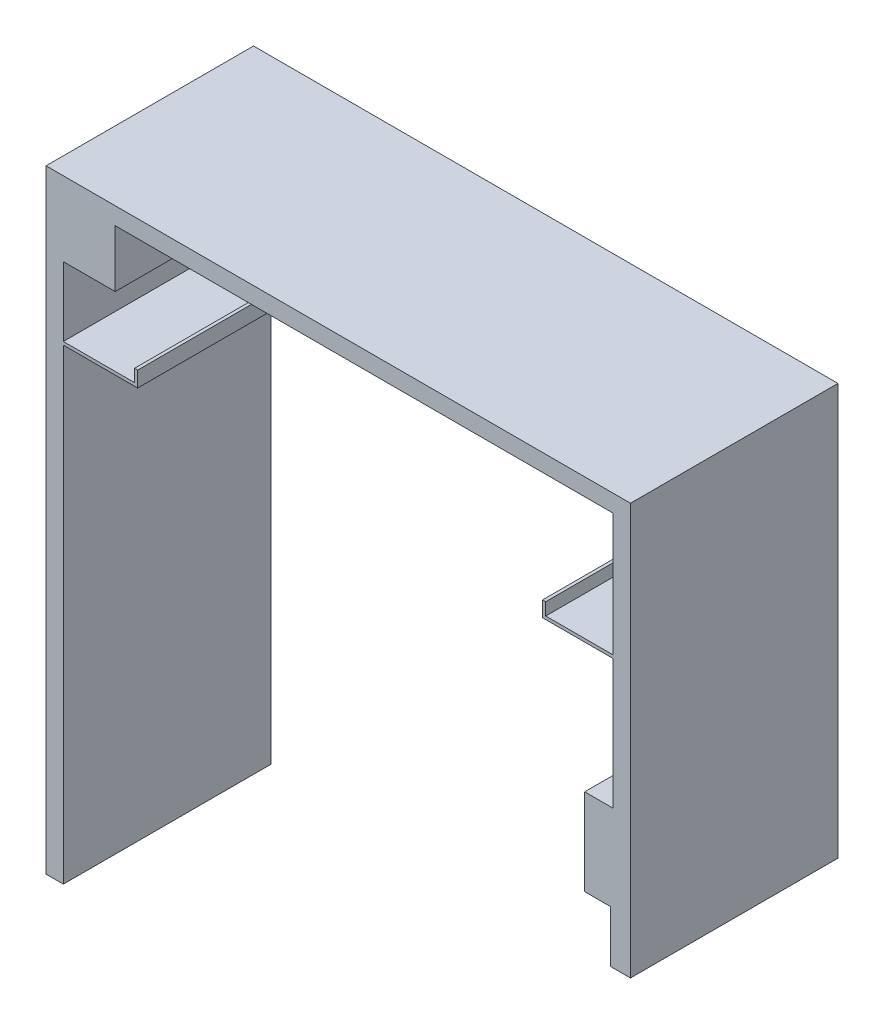
ISO-10303-21;
HEADER;
FILE_DESCRIPTION(('STEP AP214'),'2;1');
FILE_NAME('part.step','',(''),(''),'','','');
FILE_SCHEMA(('AUTOMOTIVE_DESIGN { 1 0 10303 214 1 1 1 1 }'));
ENDSEC;
DATA;
#1=APPLICATION_CONTEXT('core data for automotive mechanical design processes');
#2=APPLICATION_PROTOCOL_DEFINITION('international standard','automotive_design',2000,#1);
#3=PRODUCT_CONTEXT('',#1,'mechanical');
#4=PRODUCT('Part','Part','',(#3));
#5=PRODUCT_RELATED_PRODUCT_CATEGORY('part','',(#4));
#6=PRODUCT_DEFINITION_FORMATION('','',#4);
#7=PRODUCT_DEFINITION_CONTEXT('part definition',#1,'design');
#8=PRODUCT_DEFINITION('design','',#6,#7);
#9=PRODUCT_DEFINITION_SHAPE('','',#8);
#10=(LENGTH_UNIT() NAMED_UNIT(*) SI_UNIT(.MILLI.,.METRE.));
#11=(NAMED_UNIT(*) PLANE_ANGLE_UNIT() SI_UNIT($,.RADIAN.));
#12=(NAMED_UNIT(*) SI_UNIT($,.STERADIAN.) SOLID_ANGLE_UNIT());
#13=UNCERTAINTY_MEASURE_WITH_UNIT(LENGTH_MEASURE(1.E-05),#10,'distance_accuracy_value','');
#14=(GEOMETRIC_REPRESENTATION_CONTEXT(3) GLOBAL_UNCERTAINTY_ASSIGNED_CONTEXT((#13)) GLOBAL_UNIT_ASSIGNED_CONTEXT((#10,
#11,#12)) REPRESENTATION_CONTEXT('',''));
#15=CARTESIAN_POINT('',(0.,0.,0.));
#16=DIRECTION('',(0.,0.,1.));
#17=DIRECTION('',(1.,0.,0.));
#18=AXIS2_PLACEMENT_3D('',#15,#16,#17);
#19=CARTESIAN_POINT('',(-100.,0.,1200.));
#20=DIRECTION('',(0.,1.,0.));
#21=DIRECTION('',(0.,0.,1.));
#22=AXIS2_PLACEMENT_3D('',#19,#20,#21);
#23=PLANE('',#22);
#24=DIRECTION('',(1.,0.,0.));
#25=VECTOR('',#24,1.);
#26=CARTESIAN_POINT('',(-100.,0.,0.));
#27=LINE('',#26,#25);
#28=CARTESIAN_POINT('',(-100.,0.,0.));
#29=VERTEX_POINT('',#28);
#30=CARTESIAN_POINT('',(0.,0.,0.));
#31=VERTEX_POINT('',#30);
#32=EDGE_CURVE('E239',#29,#31,#27,.T.);
#33=ORIENTED_EDGE('',*,*,#32,.T.);
#34=DIRECTION('',(0.,0.,-1.));
#35=VECTOR('',#34,1.);
#36=CARTESIAN_POINT('',(0.,0.,1200.));
#37=LINE('',#36,#35);
#38=CARTESIAN_POINT('',(0.,0.,1200.));
#39=VERTEX_POINT('',#38);
#40=EDGE_CURVE('E11',#39,#31,#37,.T.);
#41=ORIENTED_EDGE('',*,*,#40,.F.);
#42=DIRECTION('',(1.,0.,0.));
#43=VECTOR('',#42,1.);
#44=CARTESIAN_POINT('',(-100.,0.,1200.));
#45=LINE('',#44,#43);
#46=CARTESIAN_POINT('',(-100.,0.,1200.));
#47=VERTEX_POINT('',#46);
#48=EDGE_CURVE('E289',#47,#39,#45,.T.);
#49=ORIENTED_EDGE('',*,*,#48,.F.);
#50=DIRECTION('',(0.,0.,-1.));
#51=VECTOR('',#50,1.);
#52=CARTESIAN_POINT('',(-100.,0.,1200.));
#53=LINE('',#52,#51);
#54=EDGE_CURVE('E235',#47,#29,#53,.T.);
#55=ORIENTED_EDGE('',*,*,#54,.T.);
#56=EDGE_LOOP('',(#33,#41,#49,#55));
#57=FACE_BOUND('',#56,.T.);
#58=ADVANCED_FACE('F35',(#57),#23,.F.);
#59=CARTESIAN_POINT('',(0.,0.,1200.));
#60=DIRECTION('',(-1.,0.,0.));
#61=DIRECTION('',(0.,0.,1.));
#62=AXIS2_PLACEMENT_3D('',#59,#60,#61);
#63=PLANE('',#62);
#64=DIRECTION('',(0.,1.,0.));
#65=VECTOR('',#64,1.);
#66=CARTESIAN_POINT('',(0.,0.,0.));
#67=LINE('',#66,#65);
#68=CARTESIAN_POINT('',(0.,2700.,0.));
#69=VERTEX_POINT('',#68);
#70=EDGE_CURVE('E242',#31,#69,#67,.T.);
#71=ORIENTED_EDGE('',*,*,#70,.T.);
#72=DIRECTION('',(0.,0.,-1.));
#73=VECTOR('',#72,1.);
#74=CARTESIAN_POINT('',(0.,2700.,1200.));
#75=LINE('',#74,#73);
#76=CARTESIAN_POINT('',(0.,2700.,1200.));
#77=VERTEX_POINT('',#76);
#78=EDGE_CURVE('E43',#77,#69,#75,.T.);
#79=ORIENTED_EDGE('',*,*,#78,.F.);
#80=DIRECTION('',(0.,1.,0.));
#81=VECTOR('',#80,1.);
#82=CARTESIAN_POINT('',(0.,0.,1200.));
#83=LINE('',#82,#81);
#84=EDGE_CURVE('E148',#39,#77,#83,.T.);
#85=ORIENTED_EDGE('',*,*,#84,.F.);
#86=ORIENTED_EDGE('',*,*,#40,.T.);
#87=EDGE_LOOP('',(#71,#79,#85,#86));
#88=FACE_BOUND('',#87,.T.);
#89=ADVANCED_FACE('F437',(#88),#63,.F.);
#90=CARTESIAN_POINT('',(0.,2700.,1200.));
#91=DIRECTION('',(0.,1.,0.));
#92=DIRECTION('',(0.,0.,1.));
#93=AXIS2_PLACEMENT_3D('',#90,#91,#92);
#94=PLANE('',#93);
#95=DIRECTION('',(1.,0.,0.));
#96=VECTOR('',#95,1.);
#97=CARTESIAN_POINT('',(0.,2700.,0.));
#98=LINE('',#97,#96);
#99=CARTESIAN_POINT('',(430.,2700.,0.));
#100=VERTEX_POINT('',#99);
#101=EDGE_CURVE('E244',#69,#100,#98,.T.);
#102=ORIENTED_EDGE('',*,*,#101,.T.);
#103=DIRECTION('',(0.,0.,-1.));
#104=VECTOR('',#103,1.);
#105=CARTESIAN_POINT('',(430.,2700.,1200.));
#106=LINE('',#105,#104);
#107=CARTESIAN_POINT('',(430.,2700.,1200.));
#108=VERTEX_POINT('',#107);
#109=EDGE_CURVE('E350',#108,#100,#106,.T.);
#110=ORIENTED_EDGE('',*,*,#109,.F.);
#111=DIRECTION('',(1.,0.,0.));
#112=VECTOR('',#111,1.);
#113=CARTESIAN_POINT('',(0.,2700.,1200.));
#114=LINE('',#113,#112);
#115=EDGE_CURVE('E358',#77,#108,#114,.T.);
#116=ORIENTED_EDGE('',*,*,#115,.F.);
#117=ORIENTED_EDGE('',*,*,#78,.T.);
#118=EDGE_LOOP('',(#102,#110,#116,#117));
#119=FACE_BOUND('',#118,.T.);
#120=ADVANCED_FACE('F356',(#119),#94,.F.);
#121=CARTESIAN_POINT('',(430.,2700.,1200.));
#122=DIRECTION('',(-1.,0.,0.));
#123=DIRECTION('',(0.,0.,1.));
#124=AXIS2_PLACEMENT_3D('',#121,#122,#123);
#125=PLANE('',#124);
#126=DIRECTION('',(0.,1.,0.));
#127=VECTOR('',#126,1.);
#128=CARTESIAN_POINT('',(430.,2700.,0.));
#129=LINE('',#128,#127);
#130=CARTESIAN_POINT('',(430.,2790.,0.));
#131=VERTEX_POINT('',#130);
#132=EDGE_CURVE('E246',#100,#131,#129,.T.);
#133=ORIENTED_EDGE('',*,*,#132,.T.);
#134=DIRECTION('',(0.,0.,-1.));
#135=VECTOR('',#134,1.);
#136=CARTESIAN_POINT('',(430.,2790.,1200.));
#137=LINE('',#136,#135);
#138=CARTESIAN_POINT('',(430.,2790.,1200.));
#139=VERTEX_POINT('',#138);
#140=EDGE_CURVE('E347',#139,#131,#137,.T.);
#141=ORIENTED_EDGE('',*,*,#140,.F.);
#142=DIRECTION('',(0.,1.,0.));
#143=VECTOR('',#142,1.);
#144=CARTESIAN_POINT('',(430.,2700.,1200.));
#145=LINE('',#144,#143);
#146=EDGE_CURVE('E376',#108,#139,#145,.T.);
#147=ORIENTED_EDGE('',*,*,#146,.F.);
#148=ORIENTED_EDGE('',*,*,#109,.T.);
#149=EDGE_LOOP('',(#133,#141,#147,#148));
#150=FACE_BOUND('',#149,.T.);
#151=ADVANCED_FACE('F367',(#150),#125,.F.);
#152=CARTESIAN_POINT('',(430.,2790.,1200.));
#153=DIRECTION('',(0.,-1.,0.));
#154=DIRECTION('',(0.,0.,-1.));
#155=AXIS2_PLACEMENT_3D('',#152,#153,#154);
#156=PLANE('',#155);
#157=DIRECTION('',(-1.,0.,0.));
#158=VECTOR('',#157,1.);
#159=CARTESIAN_POINT('',(430.,2790.,0.));
#160=LINE('',#159,#158);
#161=CARTESIAN_POINT('',(412.,2790.,0.));
#162=VERTEX_POINT('',#161);
#163=EDGE_CURVE('E248',#131,#162,#160,.T.);
#164=ORIENTED_EDGE('',*,*,#163,.T.);
#165=DIRECTION('',(0.,0.,-1.));
#166=VECTOR('',#165,1.);
#167=CARTESIAN_POINT('',(412.,2790.,1200.));
#168=LINE('',#167,#166);
#169=CARTESIAN_POINT('',(412.,2790.,1200.));
#170=VERTEX_POINT('',#169);
#171=EDGE_CURVE('E344',#170,#162,#168,.T.);
#172=ORIENTED_EDGE('',*,*,#171,.F.);
#173=DIRECTION('',(-1.,0.,0.));
#174=VECTOR('',#173,1.);
#175=CARTESIAN_POINT('',(430.,2790.,1200.));
#176=LINE('',#175,#174);
#177=EDGE_CURVE('E373',#139,#170,#176,.T.);
#178=ORIENTED_EDGE('',*,*,#177,.F.);
#179=ORIENTED_EDGE('',*,*,#140,.T.);
#180=EDGE_LOOP('',(#164,#172,#178,#179));
#181=FACE_BOUND('',#180,.T.);
#182=ADVANCED_FACE('F371',(#181),#156,.F.);
#183=CARTESIAN_POINT('',(412.,2790.,1200.));
#184=DIRECTION('',(1.,0.,0.));
#185=DIRECTION('',(0.,0.,-1.));
#186=AXIS2_PLACEMENT_3D('',#183,#184,#185);
#187=PLANE('',#186);
#188=DIRECTION('',(0.,-1.,0.));
#189=VECTOR('',#188,1.);
#190=CARTESIAN_POINT('',(412.,2790.,0.));
#191=LINE('',#190,#189);
#192=CARTESIAN_POINT('',(412.,2718.,0.));
#193=VERTEX_POINT('',#192);
#194=EDGE_CURVE('E250',#162,#193,#191,.T.);
#195=ORIENTED_EDGE('',*,*,#194,.T.);
#196=DIRECTION('',(0.,0.,-1.));
#197=VECTOR('',#196,1.);
#198=CARTESIAN_POINT('',(412.,2718.,1200.));
#199=LINE('',#198,#197);
#200=CARTESIAN_POINT('',(412.,2718.,1200.));
#201=VERTEX_POINT('',#200);
#202=EDGE_CURVE('E341',#201,#193,#199,.T.);
#203=ORIENTED_EDGE('',*,*,#202,.F.);
#204=DIRECTION('',(0.,-1.,0.));
#205=VECTOR('',#204,1.);
#206=CARTESIAN_POINT('',(412.,2790.,1200.));
#207=LINE('',#206,#205);
#208=EDGE_CURVE('E375',#170,#201,#207,.T.);
#209=ORIENTED_EDGE('',*,*,#208,.F.);
#210=ORIENTED_EDGE('',*,*,#171,.T.);
#211=EDGE_LOOP('',(#195,#203,#209,#210));
#212=FACE_BOUND('',#211,.T.);
#213=ADVANCED_FACE('F450',(#212),#187,.F.);
#214=CARTESIAN_POINT('',(412.,2718.,1200.));
#215=DIRECTION('',(0.,-1.,0.));
#216=DIRECTION('',(0.,0.,-1.));
#217=AXIS2_PLACEMENT_3D('',#214,#215,#216);
#218=PLANE('',#217);
#219=DIRECTION('',(-1.,0.,0.));
#220=VECTOR('',#219,1.);
#221=CARTESIAN_POINT('',(412.,2718.,0.));
#222=LINE('',#221,#220);
#223=CARTESIAN_POINT('',(0.,2718.,0.));
#224=VERTEX_POINT('',#223);
#225=EDGE_CURVE('E252',#193,#224,#222,.T.);
#226=ORIENTED_EDGE('',*,*,#225,.T.);
#227=DIRECTION('',(0.,0.,-1.));
#228=VECTOR('',#227,1.);
#229=CARTESIAN_POINT('',(0.,2718.,1200.));
#230=LINE('',#229,#228);
#231=CARTESIAN_POINT('',(0.,2718.,1200.));
#232=VERTEX_POINT('',#231);
#233=EDGE_CURVE('E338',#232,#224,#230,.T.);
#234=ORIENTED_EDGE('',*,*,#233,.F.);
#235=DIRECTION('',(-1.,0.,0.));
#236=VECTOR('',#235,1.);
#237=CARTESIAN_POINT('',(412.,2718.,1200.));
#238=LINE('',#237,#236);
#239=EDGE_CURVE('E378',#201,#232,#238,.T.);
#240=ORIENTED_EDGE('',*,*,#239,.F.);
#241=ORIENTED_EDGE('',*,*,#202,.T.);
#242=EDGE_LOOP('',(#226,#234,#240,#241));
#243=FACE_BOUND('',#242,.T.);
#244=ADVANCED_FACE('F453',(#243),#218,.F.);
#245=CARTESIAN_POINT('',(0.,2718.,1200.));
#246=DIRECTION('',(-1.,0.,0.));
#247=DIRECTION('',(0.,0.,1.));
#248=AXIS2_PLACEMENT_3D('',#245,#246,#247);
#249=PLANE('',#248);
#250=DIRECTION('',(0.,1.,0.));
#251=VECTOR('',#250,1.);
#252=CARTESIAN_POINT('',(0.,2718.,0.));
#253=LINE('',#252,#251);
#254=CARTESIAN_POINT('',(0.,3118.,0.));
#255=VERTEX_POINT('',#254);
#256=EDGE_CURVE('E254',#224,#255,#253,.T.);
#257=ORIENTED_EDGE('',*,*,#256,.T.);
#258=DIRECTION('',(0.,0.,-1.));
#259=VECTOR('',#258,1.);
#260=CARTESIAN_POINT('',(0.,3118.,1200.));
#261=LINE('',#260,#259);
#262=CARTESIAN_POINT('',(0.,3118.,1200.));
#263=VERTEX_POINT('',#262);
#264=EDGE_CURVE('E335',#263,#255,#261,.T.);
#265=ORIENTED_EDGE('',*,*,#264,.F.);
#266=DIRECTION('',(0.,1.,0.));
#267=VECTOR('',#266,1.);
#268=CARTESIAN_POINT('',(0.,2718.,1200.));
#269=LINE('',#268,#267);
#270=EDGE_CURVE('E384',#232,#263,#269,.T.);
#271=ORIENTED_EDGE('',*,*,#270,.F.);
#272=ORIENTED_EDGE('',*,*,#233,.T.);
#273=EDGE_LOOP('',(#257,#265,#271,#272));
#274=FACE_BOUND('',#273,.T.);
#275=ADVANCED_FACE('F457',(#274),#249,.F.);
#276=CARTESIAN_POINT('',(0.,3118.,1200.));
#277=DIRECTION('',(0.,1.,0.));
#278=DIRECTION('',(0.,0.,1.));
#279=AXIS2_PLACEMENT_3D('',#276,#277,#278);
#280=PLANE('',#279);
#281=DIRECTION('',(1.,0.,0.));
#282=VECTOR('',#281,1.);
#283=CARTESIAN_POINT('',(0.,3118.,0.));
#284=LINE('',#283,#282);
#285=CARTESIAN_POINT('',(300.,3118.,0.));
#286=VERTEX_POINT('',#285);
#287=EDGE_CURVE('E256',#255,#286,#284,.T.);
#288=ORIENTED_EDGE('',*,*,#287,.T.);
#289=DIRECTION('',(0.,0.,-1.));
#290=VECTOR('',#289,1.);
#291=CARTESIAN_POINT('',(300.,3118.,1200.));
#292=LINE('',#291,#290);
#293=CARTESIAN_POINT('',(300.,3118.,1200.));
#294=VERTEX_POINT('',#293);
#295=EDGE_CURVE('E332',#294,#286,#292,.T.);
#296=ORIENTED_EDGE('',*,*,#295,.F.);
#297=DIRECTION('',(1.,0.,0.));
#298=VECTOR('',#297,1.);
#299=CARTESIAN_POINT('',(0.,3118.,1200.));
#300=LINE('',#299,#298);
#301=EDGE_CURVE('E386',#263,#294,#300,.T.);
#302=ORIENTED_EDGE('',*,*,#301,.F.);
#303=ORIENTED_EDGE('',*,*,#264,.T.);
#304=EDGE_LOOP('',(#288,#296,#302,#303));
#305=FACE_BOUND('',#304,.T.);
#306=ADVANCED_FACE('F461',(#305),#280,.F.);
#307=CARTESIAN_POINT('',(300.,3118.,1200.));
#308=DIRECTION('',(-1.,0.,0.));
#309=DIRECTION('',(0.,0.,1.));
#310=AXIS2_PLACEMENT_3D('',#307,#308,#309);
#311=PLANE('',#310);
#312=DIRECTION('',(0.,1.,0.));
#313=VECTOR('',#312,1.);
#314=CARTESIAN_POINT('',(300.,3118.,0.));
#315=LINE('',#314,#313);
#316=CARTESIAN_POINT('',(300.,3448.,0.));
#317=VERTEX_POINT('',#316);
#318=EDGE_CURVE('E258',#286,#317,#315,.T.);
#319=ORIENTED_EDGE('',*,*,#318,.T.);
#320=DIRECTION('',(0.,0.,-1.));
#321=VECTOR('',#320,1.);
#322=CARTESIAN_POINT('',(300.,3448.,1200.));
#323=LINE('',#322,#321);
#324=CARTESIAN_POINT('',(300.,3448.,1200.));
#325=VERTEX_POINT('',#324);
#326=EDGE_CURVE('E329',#325,#317,#323,.T.);
#327=ORIENTED_EDGE('',*,*,#326,.F.);
#328=DIRECTION('',(0.,1.,0.));
#329=VECTOR('',#328,1.);
#330=CARTESIAN_POINT('',(300.,3118.,1200.));
#331=LINE('',#330,#329);
#332=EDGE_CURVE('E388',#294,#325,#331,.T.);
#333=ORIENTED_EDGE('',*,*,#332,.F.);
#334=ORIENTED_EDGE('',*,*,#295,.T.);
#335=EDGE_LOOP('',(#319,#327,#333,#334));
#336=FACE_BOUND('',#335,.T.);
#337=ADVANCED_FACE('F465',(#336),#311,.F.);
#338=CARTESIAN_POINT('',(300.,3448.,1200.));
#339=DIRECTION('',(0.,1.,0.));
#340=DIRECTION('',(0.,0.,1.));
#341=AXIS2_PLACEMENT_3D('',#338,#339,#340);
#342=PLANE('',#341);
#343=DIRECTION('',(1.,0.,0.));
#344=VECTOR('',#343,1.);
#345=CARTESIAN_POINT('',(300.,3448.,0.));
#346=LINE('',#345,#344);
#347=CARTESIAN_POINT('',(3180.,3448.,0.));
#348=VERTEX_POINT('',#347);
#349=EDGE_CURVE('E260',#317,#348,#346,.T.);
#350=ORIENTED_EDGE('',*,*,#349,.T.);
#351=DIRECTION('',(0.,0.,-1.));
#352=VECTOR('',#351,1.);
#353=CARTESIAN_POINT('',(3180.,3448.,1200.));
#354=LINE('',#353,#352);
#355=CARTESIAN_POINT('',(3180.,3448.,1200.));
#356=VERTEX_POINT('',#355);
#357=EDGE_CURVE('E326',#356,#348,#354,.T.);
#358=ORIENTED_EDGE('',*,*,#357,.F.);
#359=DIRECTION('',(1.,0.,0.));
#360=VECTOR('',#359,1.);
#361=CARTESIAN_POINT('',(300.,3448.,1200.));
#362=LINE('',#361,#360);
#363=EDGE_CURVE('E390',#325,#356,#362,.T.);
#364=ORIENTED_EDGE('',*,*,#363,.F.);
#365=ORIENTED_EDGE('',*,*,#326,.T.);
#366=EDGE_LOOP('',(#350,#358,#364,#365));
#367=FACE_BOUND('',#366,.T.);
#368=ADVANCED_FACE('F469',(#367),#342,.F.);
#369=CARTESIAN_POINT('',(3180.,3448.,1200.));
#370=DIRECTION('',(1.,0.,0.));
#371=DIRECTION('',(0.,0.,-1.));
#372=AXIS2_PLACEMENT_3D('',#369,#370,#371);
#373=PLANE('',#372);
#374=DIRECTION('',(0.,-1.,0.));
#375=VECTOR('',#374,1.);
#376=CARTESIAN_POINT('',(3180.,3448.,0.));
#377=LINE('',#376,#375);
#378=CARTESIAN_POINT('',(3180.,2738.,0.));
#379=VERTEX_POINT('',#378);
#380=EDGE_CURVE('E262',#348,#379,#377,.T.);
#381=ORIENTED_EDGE('',*,*,#380,.T.);
#382=DIRECTION('',(0.,0.,-1.));
#383=VECTOR('',#382,1.);
#384=CARTESIAN_POINT('',(3180.,2738.,1200.));
#385=LINE('',#384,#383);
#386=CARTESIAN_POINT('',(3180.,2738.,1200.));
#387=VERTEX_POINT('',#386);
#388=EDGE_CURVE('E323',#387,#379,#385,.T.);
#389=ORIENTED_EDGE('',*,*,#388,.F.);
#390=DIRECTION('',(0.,-1.,0.));
#391=VECTOR('',#390,1.);
#392=CARTESIAN_POINT('',(3180.,3448.,1200.));
#393=LINE('',#392,#391);
#394=EDGE_CURVE('E392',#356,#387,#393,.T.);
#395=ORIENTED_EDGE('',*,*,#394,.F.);
#396=ORIENTED_EDGE('',*,*,#357,.T.);
#397=EDGE_LOOP('',(#381,#389,#395,#396));
#398=FACE_BOUND('',#397,.T.);
#399=ADVANCED_FACE('F473',(#398),#373,.F.);
#400=CARTESIAN_POINT('',(3180.,2738.,1200.));
#401=DIRECTION('',(0.,-1.,0.));
#402=DIRECTION('',(0.,0.,-1.));
#403=AXIS2_PLACEMENT_3D('',#400,#401,#402);
#404=PLANE('',#403);
#405=DIRECTION('',(-1.,0.,0.));
#406=VECTOR('',#405,1.);
#407=CARTESIAN_POINT('',(3180.,2738.,0.));
#408=LINE('',#407,#406);
#409=CARTESIAN_POINT('',(2790.,2738.,0.));
#410=VERTEX_POINT('',#409);
#411=EDGE_CURVE('E264',#379,#410,#408,.T.);
#412=ORIENTED_EDGE('',*,*,#411,.T.);
#413=DIRECTION('',(0.,0.,-1.));
#414=VECTOR('',#413,1.);
#415=CARTESIAN_POINT('',(2790.,2738.,1200.));
#416=LINE('',#415,#414);
#417=CARTESIAN_POINT('',(2790.,2738.,1200.));
#418=VERTEX_POINT('',#417);
#419=EDGE_CURVE('E320',#418,#410,#416,.T.);
#420=ORIENTED_EDGE('',*,*,#419,.F.);
#421=DIRECTION('',(-1.,0.,0.));
#422=VECTOR('',#421,1.);
#423=CARTESIAN_POINT('',(3180.,2738.,1200.));
#424=LINE('',#423,#422);
#425=EDGE_CURVE('E394',#387,#418,#424,.T.);
#426=ORIENTED_EDGE('',*,*,#425,.F.);
#427=ORIENTED_EDGE('',*,*,#388,.T.);
#428=EDGE_LOOP('',(#412,#420,#426,#427));
#429=FACE_BOUND('',#428,.T.);
#430=ADVANCED_FACE('F477',(#429),#404,.F.);
#431=CARTESIAN_POINT('',(2790.,2738.,1200.));
#432=DIRECTION('',(-1.,0.,0.));
#433=DIRECTION('',(0.,0.,1.));
#434=AXIS2_PLACEMENT_3D('',#431,#432,#433);
#435=PLANE('',#434);
#436=DIRECTION('',(0.,1.,0.));
#437=VECTOR('',#436,1.);
#438=CARTESIAN_POINT('',(2790.,2738.,0.));
#439=LINE('',#438,#437);
#440=CARTESIAN_POINT('',(2790.,2810.,0.));
#441=VERTEX_POINT('',#440);
#442=EDGE_CURVE('E266',#410,#441,#439,.T.);
#443=ORIENTED_EDGE('',*,*,#442,.T.);
#444=DIRECTION('',(0.,0.,-1.));
#445=VECTOR('',#444,1.);
#446=CARTESIAN_POINT('',(2790.,2810.,1200.));
#447=LINE('',#446,#445);
#448=CARTESIAN_POINT('',(2790.,2810.,1200.));
#449=VERTEX_POINT('',#448);
#450=EDGE_CURVE('E317',#449,#441,#447,.T.);
#451=ORIENTED_EDGE('',*,*,#450,.F.);
#452=DIRECTION('',(0.,1.,0.));
#453=VECTOR('',#452,1.);
#454=CARTESIAN_POINT('',(2790.,2738.,1200.));
#455=LINE('',#454,#453);
#456=EDGE_CURVE('E396',#418,#449,#455,.T.);
#457=ORIENTED_EDGE('',*,*,#456,.F.);
#458=ORIENTED_EDGE('',*,*,#419,.T.);
#459=EDGE_LOOP('',(#443,#451,#457,#458));
#460=FACE_BOUND('',#459,.T.);
#461=ADVANCED_FACE('F481',(#460),#435,.F.);
#462=CARTESIAN_POINT('',(2790.,2810.,1200.));
#463=DIRECTION('',(0.,-1.,0.));
#464=DIRECTION('',(0.,0.,-1.));
#465=AXIS2_PLACEMENT_3D('',#462,#463,#464);
#466=PLANE('',#465);
#467=DIRECTION('',(-1.,0.,0.));
#468=VECTOR('',#467,1.);
#469=CARTESIAN_POINT('',(2790.,2810.,0.));
#470=LINE('',#469,#468);
#471=CARTESIAN_POINT('',(2772.,2810.,0.));
#472=VERTEX_POINT('',#471);
#473=EDGE_CURVE('E268',#441,#472,#470,.T.);
#474=ORIENTED_EDGE('',*,*,#473,.T.);
#475=DIRECTION('',(0.,0.,-1.));
#476=VECTOR('',#475,1.);
#477=CARTESIAN_POINT('',(2772.,2810.,1200.));
#478=LINE('',#477,#476);
#479=CARTESIAN_POINT('',(2772.,2810.,1200.));
#480=VERTEX_POINT('',#479);
#481=EDGE_CURVE('E314',#480,#472,#478,.T.);
#482=ORIENTED_EDGE('',*,*,#481,.F.);
#483=DIRECTION('',(-1.,0.,0.));
#484=VECTOR('',#483,1.);
#485=CARTESIAN_POINT('',(2790.,2810.,1200.));
#486=LINE('',#485,#484);
#487=EDGE_CURVE('E398',#449,#480,#486,.T.);
#488=ORIENTED_EDGE('',*,*,#487,.F.);
#489=ORIENTED_EDGE('',*,*,#450,.T.);
#490=EDGE_LOOP('',(#474,#482,#488,#489));
#491=FACE_BOUND('',#490,.T.);
#492=ADVANCED_FACE('F485',(#491),#466,.F.);
#493=CARTESIAN_POINT('',(2772.,2810.,1200.));
#494=DIRECTION('',(1.,0.,0.));
#495=DIRECTION('',(0.,0.,-1.));
#496=AXIS2_PLACEMENT_3D('',#493,#494,#495);
#497=PLANE('',#496);
#498=DIRECTION('',(0.,-1.,0.));
#499=VECTOR('',#498,1.);
#500=CARTESIAN_POINT('',(2772.,2810.,0.));
#501=LINE('',#500,#499);
#502=CARTESIAN_POINT('',(2772.,2720.,0.));
#503=VERTEX_POINT('',#502);
#504=EDGE_CURVE('E270',#472,#503,#501,.T.);
#505=ORIENTED_EDGE('',*,*,#504,.T.);
#506=DIRECTION('',(0.,0.,-1.));
#507=VECTOR('',#506,1.);
#508=CARTESIAN_POINT('',(2772.,2720.,1200.));
#509=LINE('',#508,#507);
#510=CARTESIAN_POINT('',(2772.,2720.,1200.));
#511=VERTEX_POINT('',#510);
#512=EDGE_CURVE('E311',#511,#503,#509,.T.);
#513=ORIENTED_EDGE('',*,*,#512,.F.);
#514=DIRECTION('',(0.,-1.,0.));
#515=VECTOR('',#514,1.);
#516=CARTESIAN_POINT('',(2772.,2810.,1200.));
#517=LINE('',#516,#515);
#518=EDGE_CURVE('E400',#480,#511,#517,.T.);
#519=ORIENTED_EDGE('',*,*,#518,.F.);
#520=ORIENTED_EDGE('',*,*,#481,.T.);
#521=EDGE_LOOP('',(#505,#513,#519,#520));
#522=FACE_BOUND('',#521,.T.);
#523=ADVANCED_FACE('F489',(#522),#497,.F.);
#524=CARTESIAN_POINT('',(2772.,2720.,1200.));
#525=DIRECTION('',(0.,1.,0.));
#526=DIRECTION('',(-1.,0.,0.));
#527=AXIS2_PLACEMENT_3D('',#524,#525,#526);
#528=PLANE('',#527);
#529=DIRECTION('',(1.,0.,0.));
#530=VECTOR('',#529,1.);
#531=CARTESIAN_POINT('',(2772.,2720.,0.));
#532=LINE('',#531,#530);
#533=CARTESIAN_POINT('',(3180.,2720.,0.));
#534=VERTEX_POINT('',#533);
#535=EDGE_CURVE('E272',#503,#534,#532,.T.);
#536=ORIENTED_EDGE('',*,*,#535,.T.);
#537=DIRECTION('',(0.,0.,-1.));
#538=VECTOR('',#537,1.);
#539=CARTESIAN_POINT('',(3180.,2720.,1200.));
#540=LINE('',#539,#538);
#541=CARTESIAN_POINT('',(3180.,2720.,1200.));
#542=VERTEX_POINT('',#541);
#543=EDGE_CURVE('E308',#542,#534,#540,.T.);
#544=ORIENTED_EDGE('',*,*,#543,.F.);
#545=DIRECTION('',(1.,0.,0.));
#546=VECTOR('',#545,1.);
#547=CARTESIAN_POINT('',(2772.,2720.,1200.));
#548=LINE('',#547,#546);
#549=EDGE_CURVE('E402',#511,#542,#548,.T.);
#550=ORIENTED_EDGE('',*,*,#549,.F.);
#551=ORIENTED_EDGE('',*,*,#512,.T.);
#552=EDGE_LOOP('',(#536,#544,#550,#551));
#553=FACE_BOUND('',#552,.T.);
#554=ADVANCED_FACE('F493',(#553),#528,.F.);
#555=CARTESIAN_POINT('',(3180.,2720.,1200.));
#556=DIRECTION('',(1.,0.,0.));
#557=DIRECTION('',(0.,1.,0.));
#558=AXIS2_PLACEMENT_3D('',#555,#556,#557);
#559=PLANE('',#558);
#560=DIRECTION('',(0.,-1.,0.));
#561=VECTOR('',#560,1.);
#562=CARTESIAN_POINT('',(3180.,2720.,0.));
#563=LINE('',#562,#561);
#564=CARTESIAN_POINT('',(3180.,1970.,0.));
#565=VERTEX_POINT('',#564);
#566=EDGE_CURVE('E274',#534,#565,#563,.T.);
#567=ORIENTED_EDGE('',*,*,#566,.T.);
#568=DIRECTION('',(0.,0.,-1.));
#569=VECTOR('',#568,1.);
#570=CARTESIAN_POINT('',(3180.,1970.,1200.));
#571=LINE('',#570,#569);
#572=CARTESIAN_POINT('',(3180.,1970.,1200.));
#573=VERTEX_POINT('',#572);
#574=EDGE_CURVE('E305',#573,#565,#571,.T.);
#575=ORIENTED_EDGE('',*,*,#574,.F.);
#576=DIRECTION('',(0.,-1.,0.));
#577=VECTOR('',#576,1.);
#578=CARTESIAN_POINT('',(3180.,2720.,1200.));
#579=LINE('',#578,#577);
#580=EDGE_CURVE('E404',#542,#573,#579,.T.);
#581=ORIENTED_EDGE('',*,*,#580,.F.);
#582=ORIENTED_EDGE('',*,*,#543,.T.);
#583=EDGE_LOOP('',(#567,#575,#581,#582));
#584=FACE_BOUND('',#583,.T.);
#585=ADVANCED_FACE('F497',(#584),#559,.F.);
#586=CARTESIAN_POINT('',(3180.,1970.,1200.));
#587=DIRECTION('',(0.,-1.,0.));
#588=DIRECTION('',(1.,0.,0.));
#589=AXIS2_PLACEMENT_3D('',#586,#587,#588);
#590=PLANE('',#589);
#591=DIRECTION('',(-1.,0.,0.));
#592=VECTOR('',#591,1.);
#593=CARTESIAN_POINT('',(3180.,1970.,0.));
#594=LINE('',#593,#592);
#595=CARTESIAN_POINT('',(3015.,1970.,0.));
#596=VERTEX_POINT('',#595);
#597=EDGE_CURVE('E276',#565,#596,#594,.T.);
#598=ORIENTED_EDGE('',*,*,#597,.T.);
#599=DIRECTION('',(0.,0.,-1.));
#600=VECTOR('',#599,1.);
#601=CARTESIAN_POINT('',(3015.,1970.,1200.));
#602=LINE('',#601,#600);
#603=CARTESIAN_POINT('',(3015.,1970.,1200.));
#604=VERTEX_POINT('',#603);
#605=EDGE_CURVE('E302',#604,#596,#602,.T.);
#606=ORIENTED_EDGE('',*,*,#605,.F.);
#607=DIRECTION('',(-1.,0.,0.));
#608=VECTOR('',#607,1.);
#609=CARTESIAN_POINT('',(3180.,1970.,1200.));
#610=LINE('',#609,#608);
#611=EDGE_CURVE('E406',#573,#604,#610,.T.);
#612=ORIENTED_EDGE('',*,*,#611,.F.);
#613=ORIENTED_EDGE('',*,*,#574,.T.);
#614=EDGE_LOOP('',(#598,#606,#612,#613));
#615=FACE_BOUND('',#614,.T.);
#616=ADVANCED_FACE('F501',(#615),#590,.F.);
#617=CARTESIAN_POINT('',(3015.,1970.,1200.));
#618=DIRECTION('',(1.,0.,0.));
#619=DIRECTION('',(0.,0.,-1.));
#620=AXIS2_PLACEMENT_3D('',#617,#618,#619);
#621=PLANE('',#620);
#622=DIRECTION('',(0.,-1.,0.));
#623=VECTOR('',#622,1.);
#624=CARTESIAN_POINT('',(3015.,1970.,0.));
#625=LINE('',#624,#623);
#626=CARTESIAN_POINT('',(3015.,1470.,0.));
#627=VERTEX_POINT('',#626);
#628=EDGE_CURVE('E278',#596,#627,#625,.T.);
#629=ORIENTED_EDGE('',*,*,#628,.T.);
#630=DIRECTION('',(0.,0.,-1.));
#631=VECTOR('',#630,1.);
#632=CARTESIAN_POINT('',(3015.,1470.,1200.));
#633=LINE('',#632,#631);
#634=CARTESIAN_POINT('',(3015.,1470.,1200.));
#635=VERTEX_POINT('',#634);
#636=EDGE_CURVE('E299',#635,#627,#633,.T.);
#637=ORIENTED_EDGE('',*,*,#636,.F.);
#638=DIRECTION('',(0.,-1.,0.));
#639=VECTOR('',#638,1.);
#640=CARTESIAN_POINT('',(3015.,1970.,1200.));
#641=LINE('',#640,#639);
#642=EDGE_CURVE('E408',#604,#635,#641,.T.);
#643=ORIENTED_EDGE('',*,*,#642,.F.);
#644=ORIENTED_EDGE('',*,*,#605,.T.);
#645=EDGE_LOOP('',(#629,#637,#643,#644));
#646=FACE_BOUND('',#645,.T.);
#647=ADVANCED_FACE('F505',(#646),#621,.F.);
#648=CARTESIAN_POINT('',(3015.,1470.,1200.));
#649=DIRECTION('',(0.,1.,0.));
#650=DIRECTION('',(-1.,0.,0.));
#651=AXIS2_PLACEMENT_3D('',#648,#649,#650);
#652=PLANE('',#651);
#653=DIRECTION('',(1.,0.,0.));
#654=VECTOR('',#653,1.);
#655=CARTESIAN_POINT('',(3015.,1470.,0.));
#656=LINE('',#655,#654);
#657=CARTESIAN_POINT('',(3165.,1470.,0.));
#658=VERTEX_POINT('',#657);
#659=EDGE_CURVE('E280',#627,#658,#656,.T.);
#660=ORIENTED_EDGE('',*,*,#659,.T.);
#661=DIRECTION('',(0.,0.,-1.));
#662=VECTOR('',#661,1.);
#663=CARTESIAN_POINT('',(3165.,1470.,1200.));
#664=LINE('',#663,#662);
#665=CARTESIAN_POINT('',(3165.,1470.,1200.));
#666=VERTEX_POINT('',#665);
#667=EDGE_CURVE('E296',#666,#658,#664,.T.);
#668=ORIENTED_EDGE('',*,*,#667,.F.);
#669=DIRECTION('',(1.,0.,0.));
#670=VECTOR('',#669,1.);
#671=CARTESIAN_POINT('',(3015.,1470.,1200.));
#672=LINE('',#671,#670);
#673=EDGE_CURVE('E410',#635,#666,#672,.T.);
#674=ORIENTED_EDGE('',*,*,#673,.F.);
#675=ORIENTED_EDGE('',*,*,#636,.T.);
#676=EDGE_LOOP('',(#660,#668,#674,#675));
#677=FACE_BOUND('',#676,.T.);
#678=ADVANCED_FACE('F509',(#677),#652,.F.);
#679=CARTESIAN_POINT('',(3165.,1470.,1200.));
#680=DIRECTION('',(1.,0.,0.));
#681=DIRECTION('',(0.,0.,-1.));
#682=AXIS2_PLACEMENT_3D('',#679,#680,#681);
#683=PLANE('',#682);
#684=DIRECTION('',(0.,-1.,0.));
#685=VECTOR('',#684,1.);
#686=CARTESIAN_POINT('',(3165.,1470.,0.));
#687=LINE('',#686,#685);
#688=CARTESIAN_POINT('',(3165.,1170.,0.));
#689=VERTEX_POINT('',#688);
#690=EDGE_CURVE('E282',#658,#689,#687,.T.);
#691=ORIENTED_EDGE('',*,*,#690,.T.);
#692=DIRECTION('',(0.,0.,-1.));
#693=VECTOR('',#692,1.);
#694=CARTESIAN_POINT('',(3165.,1170.,1200.));
#695=LINE('',#694,#693);
#696=CARTESIAN_POINT('',(3165.,1170.,1200.));
#697=VERTEX_POINT('',#696);
#698=EDGE_CURVE('E293',#697,#689,#695,.T.);
#699=ORIENTED_EDGE('',*,*,#698,.F.);
#700=DIRECTION('',(0.,-1.,0.));
#701=VECTOR('',#700,1.);
#702=CARTESIAN_POINT('',(3165.,1470.,1200.));
#703=LINE('',#702,#701);
#704=EDGE_CURVE('E412',#666,#697,#703,.T.);
#705=ORIENTED_EDGE('',*,*,#704,.F.);
#706=ORIENTED_EDGE('',*,*,#667,.T.);
#707=EDGE_LOOP('',(#691,#699,#705,#706));
#708=FACE_BOUND('',#707,.T.);
#709=ADVANCED_FACE('F418',(#708),#683,.F.);
#710=CARTESIAN_POINT('',(3165.,1170.,1200.));
#711=DIRECTION('',(0.,1.,0.));
#712=DIRECTION('',(0.,0.,1.));
#713=AXIS2_PLACEMENT_3D('',#710,#711,#712);
#714=PLANE('',#713);
#715=DIRECTION('',(1.,0.,0.));
#716=VECTOR('',#715,1.);
#717=CARTESIAN_POINT('',(3165.,1170.,0.));
#718=LINE('',#717,#716);
#719=CARTESIAN_POINT('',(3280.,1170.,0.));
#720=VERTEX_POINT('',#719);
#721=EDGE_CURVE('E284',#689,#720,#718,.T.);
#722=ORIENTED_EDGE('',*,*,#721,.T.);
#723=DIRECTION('',(0.,0.,-1.));
#724=VECTOR('',#723,1.);
#725=CARTESIAN_POINT('',(3280.,1170.,1200.));
#726=LINE('',#725,#724);
#727=CARTESIAN_POINT('',(3280.,1170.,1200.));
#728=VERTEX_POINT('',#727);
#729=EDGE_CURVE('E230',#728,#720,#726,.T.);
#730=ORIENTED_EDGE('',*,*,#729,.F.);
#731=DIRECTION('',(1.,0.,0.));
#732=VECTOR('',#731,1.);
#733=CARTESIAN_POINT('',(3165.,1170.,1200.));
#734=LINE('',#733,#732);
#735=EDGE_CURVE('E221',#697,#728,#734,.T.);
#736=ORIENTED_EDGE('',*,*,#735,.F.);
#737=ORIENTED_EDGE('',*,*,#698,.T.);
#738=EDGE_LOOP('',(#722,#730,#736,#737));
#739=FACE_BOUND('',#738,.T.);
#740=ADVANCED_FACE('F422',(#739),#714,.F.);
#741=CARTESIAN_POINT('',(3280.,1170.,1200.));
#742=DIRECTION('',(-1.,0.,0.));
#743=DIRECTION('',(0.,-1.,0.));
#744=AXIS2_PLACEMENT_3D('',#741,#742,#743);
#745=PLANE('',#744);
#746=DIRECTION('',(0.,1.,0.));
#747=VECTOR('',#746,1.);
#748=CARTESIAN_POINT('',(3280.,1170.,0.));
#749=LINE('',#748,#747);
#750=CARTESIAN_POINT('',(3280.,3548.,0.));
#751=VERTEX_POINT('',#750);
#752=EDGE_CURVE('E229',#720,#751,#749,.T.);
#753=ORIENTED_EDGE('',*,*,#752,.T.);
#754=DIRECTION('',(0.,0.,-1.));
#755=VECTOR('',#754,1.);
#756=CARTESIAN_POINT('',(3280.,3548.,1200.));
#757=LINE('',#756,#755);
#758=CARTESIAN_POINT('',(3280.,3548.,1200.));
#759=VERTEX_POINT('',#758);
#760=EDGE_CURVE('E226',#759,#751,#757,.T.);
#761=ORIENTED_EDGE('',*,*,#760,.F.);
#762=DIRECTION('',(0.,1.,0.));
#763=VECTOR('',#762,1.);
#764=CARTESIAN_POINT('',(3280.,1170.,1200.));
#765=LINE('',#764,#763);
#766=EDGE_CURVE('E215',#728,#759,#765,.T.);
#767=ORIENTED_EDGE('',*,*,#766,.F.);
#768=ORIENTED_EDGE('',*,*,#729,.T.);
#769=EDGE_LOOP('',(#753,#761,#767,#768));
#770=FACE_BOUND('',#769,.T.);
#771=ADVANCED_FACE('F227',(#770),#745,.F.);
#772=CARTESIAN_POINT('',(3280.,3548.,1200.));
#773=DIRECTION('',(0.,-1.,0.));
#774=DIRECTION('',(1.,0.,0.));
#775=AXIS2_PLACEMENT_3D('',#772,#773,#774);
#776=PLANE('',#775);
#777=DIRECTION('',(-1.,0.,0.));
#778=VECTOR('',#777,1.);
#779=CARTESIAN_POINT('',(3280.,3548.,0.));
#780=LINE('',#779,#778);
#781=CARTESIAN_POINT('',(-100.,3548.,0.));
#782=VERTEX_POINT('',#781);
#783=EDGE_CURVE('E134',#751,#782,#780,.T.);
#784=ORIENTED_EDGE('',*,*,#783,.T.);
#785=DIRECTION('',(0.,0.,-1.));
#786=VECTOR('',#785,1.);
#787=CARTESIAN_POINT('',(-100.,3548.,1200.));
#788=LINE('',#787,#786);
#789=CARTESIAN_POINT('',(-100.,3548.,1200.));
#790=VERTEX_POINT('',#789);
#791=EDGE_CURVE('E231',#790,#782,#788,.T.);
#792=ORIENTED_EDGE('',*,*,#791,.F.);
#793=DIRECTION('',(-1.,0.,0.));
#794=VECTOR('',#793,1.);
#795=CARTESIAN_POINT('',(3280.,3548.,1200.));
#796=LINE('',#795,#794);
#797=EDGE_CURVE('E219',#759,#790,#796,.T.);
#798=ORIENTED_EDGE('',*,*,#797,.F.);
#799=ORIENTED_EDGE('',*,*,#760,.T.);
#800=EDGE_LOOP('',(#784,#792,#798,#799));
#801=FACE_BOUND('',#800,.T.);
#802=ADVANCED_FACE('F233',(#801),#776,.F.);
#803=CARTESIAN_POINT('',(-100.,3548.,1200.));
#804=DIRECTION('',(1.,0.,0.));
#805=DIRECTION('',(0.,1.,0.));
#806=AXIS2_PLACEMENT_3D('',#803,#804,#805);
#807=PLANE('',#806);
#808=DIRECTION('',(0.,-1.,0.));
#809=VECTOR('',#808,1.);
#810=CARTESIAN_POINT('',(-100.,3548.,0.));
#811=LINE('',#810,#809);
#812=EDGE_CURVE('E140',#782,#29,#811,.T.);
#813=ORIENTED_EDGE('',*,*,#812,.T.);
#814=ORIENTED_EDGE('',*,*,#54,.F.);
#815=DIRECTION('',(0.,-1.,0.));
#816=VECTOR('',#815,1.);
#817=CARTESIAN_POINT('',(-100.,3548.,1200.));
#818=LINE('',#817,#816);
#819=EDGE_CURVE('E51',#790,#47,#818,.T.);
#820=ORIENTED_EDGE('',*,*,#819,.F.);
#821=ORIENTED_EDGE('',*,*,#791,.T.);
#822=EDGE_LOOP('',(#813,#814,#820,#821));
#823=FACE_BOUND('',#822,.T.);
#824=ADVANCED_FACE('F426',(#823),#807,.F.);
#825=CARTESIAN_POINT('',(0.,0.,1200.));
#826=DIRECTION('',(0.,0.,1.));
#827=DIRECTION('',(1.,0.,0.));
#828=AXIS2_PLACEMENT_3D('',#825,#826,#827);
#829=PLANE('',#828);
#830=ORIENTED_EDGE('',*,*,#48,.T.);
#831=ORIENTED_EDGE('',*,*,#84,.T.);
#832=ORIENTED_EDGE('',*,*,#115,.T.);
#833=ORIENTED_EDGE('',*,*,#146,.T.);
#834=ORIENTED_EDGE('',*,*,#177,.T.);
#835=ORIENTED_EDGE('',*,*,#208,.T.);
#836=ORIENTED_EDGE('',*,*,#239,.T.);
#837=ORIENTED_EDGE('',*,*,#270,.T.);
#838=ORIENTED_EDGE('',*,*,#301,.T.);
#839=ORIENTED_EDGE('',*,*,#332,.T.);
#840=ORIENTED_EDGE('',*,*,#363,.T.);
#841=ORIENTED_EDGE('',*,*,#394,.T.);
#842=ORIENTED_EDGE('',*,*,#425,.T.);
#843=ORIENTED_EDGE('',*,*,#456,.T.);
#844=ORIENTED_EDGE('',*,*,#487,.T.);
#845=ORIENTED_EDGE('',*,*,#518,.T.);
#846=ORIENTED_EDGE('',*,*,#549,.T.);
#847=ORIENTED_EDGE('',*,*,#580,.T.);
#848=ORIENTED_EDGE('',*,*,#611,.T.);
#849=ORIENTED_EDGE('',*,*,#642,.T.);
#850=ORIENTED_EDGE('',*,*,#673,.T.);
#851=ORIENTED_EDGE('',*,*,#704,.T.);
#852=ORIENTED_EDGE('',*,*,#735,.T.);
#853=ORIENTED_EDGE('',*,*,#766,.T.);
#854=ORIENTED_EDGE('',*,*,#797,.T.);
#855=ORIENTED_EDGE('',*,*,#819,.T.);
#856=EDGE_LOOP('',(#830,#831,#832,#833,#834,#835,#836,#837,#838,#839,#840,#841,#842,#843,#844,
#845,#846,#847,#848,#849,#850,#851,#852,#853,#854,#855));
#857=FACE_BOUND('',#856,.T.);
#858=ADVANCED_FACE('F217',(#857),#829,.T.);
#859=CARTESIAN_POINT('',(0.,0.,0.));
#860=DIRECTION('',(0.,0.,1.));
#861=DIRECTION('',(1.,0.,0.));
#862=AXIS2_PLACEMENT_3D('',#859,#860,#861);
#863=PLANE('',#862);
#864=ORIENTED_EDGE('',*,*,#32,.F.);
#865=ORIENTED_EDGE('',*,*,#812,.F.);
#866=ORIENTED_EDGE('',*,*,#783,.F.);
#867=ORIENTED_EDGE('',*,*,#752,.F.);
#868=ORIENTED_EDGE('',*,*,#721,.F.);
#869=ORIENTED_EDGE('',*,*,#690,.F.);
#870=ORIENTED_EDGE('',*,*,#659,.F.);
#871=ORIENTED_EDGE('',*,*,#628,.F.);
#872=ORIENTED_EDGE('',*,*,#597,.F.);
#873=ORIENTED_EDGE('',*,*,#566,.F.);
#874=ORIENTED_EDGE('',*,*,#535,.F.);
#875=ORIENTED_EDGE('',*,*,#504,.F.);
#876=ORIENTED_EDGE('',*,*,#473,.F.);
#877=ORIENTED_EDGE('',*,*,#442,.F.);
#878=ORIENTED_EDGE('',*,*,#411,.F.);
#879=ORIENTED_EDGE('',*,*,#380,.F.);
#880=ORIENTED_EDGE('',*,*,#349,.F.);
#881=ORIENTED_EDGE('',*,*,#318,.F.);
#882=ORIENTED_EDGE('',*,*,#287,.F.);
#883=ORIENTED_EDGE('',*,*,#256,.F.);
#884=ORIENTED_EDGE('',*,*,#225,.F.);
#885=ORIENTED_EDGE('',*,*,#194,.F.);
#886=ORIENTED_EDGE('',*,*,#163,.F.);
#887=ORIENTED_EDGE('',*,*,#132,.F.);
#888=ORIENTED_EDGE('',*,*,#101,.F.);
#889=ORIENTED_EDGE('',*,*,#70,.F.);
#890=EDGE_LOOP('',(#864,#865,#866,#867,#868,#869,#870,#871,#872,#873,#874,#875,#876,#877,#878,
#879,#880,#881,#882,#883,#884,#885,#886,#887,#888,#889));
#891=FACE_BOUND('',#890,.T.);
#892=ADVANCED_FACE('F362',(#891),#863,.F.);
#893=CLOSED_SHELL('',(#58,#89,#120,#151,#182,#213,#244,#275,#306,#337,#368,#399,#430,#461,#492,
#523,#554,#585,#616,#647,#678,#709,#740,#771,#802,#824,#858,#892));
#894=MANIFOLD_SOLID_BREP('B2',#893);
#895=ADVANCED_BREP_SHAPE_REPRESENTATION('',(#18,#894),#14);
#896=SHAPE_DEFINITION_REPRESENTATION(#9,#895);
ENDSEC;
END-ISO-10303-21;
